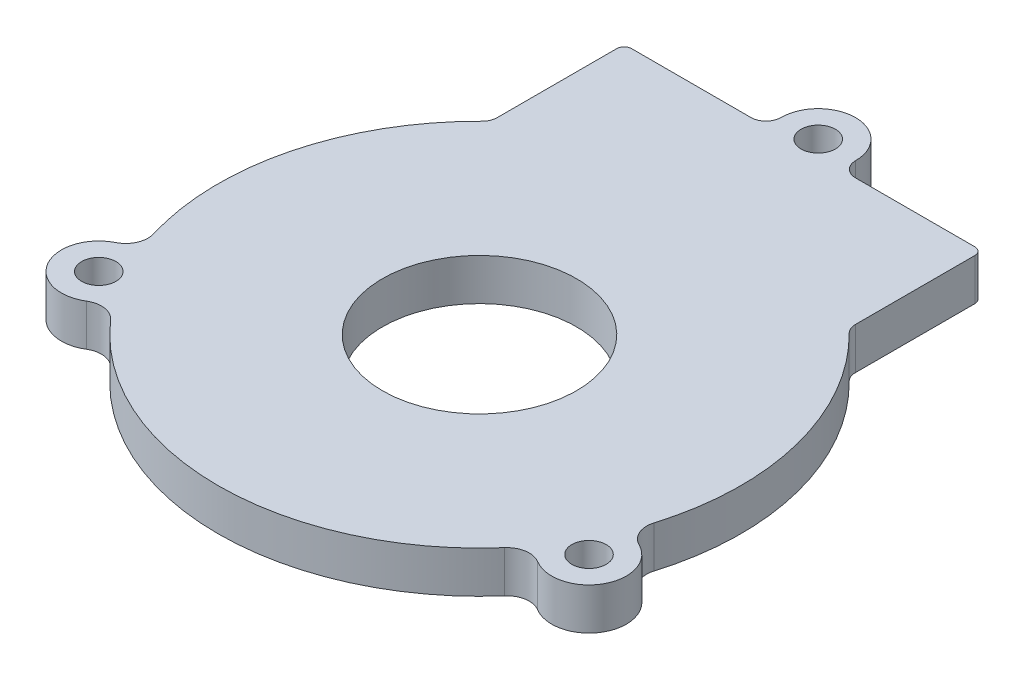
ISO-10303-21;
HEADER;
FILE_DESCRIPTION(('STEP AP214'),'2;1');
FILE_NAME('part.step','',(''),(''),'','','');
FILE_SCHEMA(('AUTOMOTIVE_DESIGN { 1 0 10303 214 1 1 1 1 }'));
ENDSEC;
DATA;
#1=APPLICATION_CONTEXT('core data for automotive mechanical design processes');
#2=APPLICATION_PROTOCOL_DEFINITION('international standard','automotive_design',2000,#1);
#3=PRODUCT_CONTEXT('',#1,'mechanical');
#4=PRODUCT('Part','Part','',(#3));
#5=PRODUCT_RELATED_PRODUCT_CATEGORY('part','',(#4));
#6=PRODUCT_DEFINITION_FORMATION('','',#4);
#7=PRODUCT_DEFINITION_CONTEXT('part definition',#1,'design');
#8=PRODUCT_DEFINITION('design','',#6,#7);
#9=PRODUCT_DEFINITION_SHAPE('','',#8);
#10=(LENGTH_UNIT() NAMED_UNIT(*) SI_UNIT(.MILLI.,.METRE.));
#11=(NAMED_UNIT(*) PLANE_ANGLE_UNIT() SI_UNIT($,.RADIAN.));
#12=(NAMED_UNIT(*) SI_UNIT($,.STERADIAN.) SOLID_ANGLE_UNIT());
#13=UNCERTAINTY_MEASURE_WITH_UNIT(LENGTH_MEASURE(1.E-05),#10,'distance_accuracy_value','');
#14=(GEOMETRIC_REPRESENTATION_CONTEXT(3) GLOBAL_UNCERTAINTY_ASSIGNED_CONTEXT((#13)) GLOBAL_UNIT_ASSIGNED_CONTEXT((#10,
#11,#12)) REPRESENTATION_CONTEXT('',''));
#15=CARTESIAN_POINT('',(0.,0.,0.));
#16=DIRECTION('',(0.,0.,1.));
#17=DIRECTION('',(1.,0.,0.));
#18=AXIS2_PLACEMENT_3D('',#15,#16,#17);
#19=CARTESIAN_POINT('',(32.785,5.588,-68.7014714818341));
#20=DIRECTION('',(0.,-1.,0.));
#21=DIRECTION('',(0.,0.,-1.));
#22=AXIS2_PLACEMENT_3D('',#19,#20,#21);
#23=CYLINDRICAL_SURFACE('',#22,5.);
#24=CARTESIAN_POINT('',(32.785,0.,-68.7014714818341));
#25=DIRECTION('',(0.,1.,0.));
#26=DIRECTION('',(0.,0.,1.));
#27=AXIS2_PLACEMENT_3D('',#24,#25,#26);
#28=CIRCLE('',#27,5.);
#29=CARTESIAN_POINT('',(37.785,0.,-68.7014714818341));
#30=VERTEX_POINT('',#29);
#31=CARTESIAN_POINT('',(27.785,0.,-68.7014714818341));
#32=VERTEX_POINT('',#31);
#33=EDGE_CURVE('E278',#30,#32,#28,.T.);
#34=ORIENTED_EDGE('',*,*,#33,.T.);
#35=DIRECTION('',(0.,-1.,0.));
#36=VECTOR('',#35,1.);
#37=CARTESIAN_POINT('',(27.785,5.588,-68.7014714818341));
#38=LINE('',#37,#36);
#39=CARTESIAN_POINT('',(27.785,5.588,-68.7014714818341));
#40=VERTEX_POINT('',#39);
#41=EDGE_CURVE('E311',#32,#40,#38,.F.);
#42=ORIENTED_EDGE('',*,*,#41,.T.);
#43=CARTESIAN_POINT('',(32.785,5.588,-68.7014714818341));
#44=DIRECTION('',(0.,1.,0.));
#45=DIRECTION('',(0.,0.,1.));
#46=AXIS2_PLACEMENT_3D('',#43,#44,#45);
#47=CIRCLE('',#46,5.);
#48=CARTESIAN_POINT('',(37.785,5.588,-68.7014714818341));
#49=VERTEX_POINT('',#48);
#50=EDGE_CURVE('E380',#49,#40,#47,.T.);
#51=ORIENTED_EDGE('',*,*,#50,.F.);
#52=DIRECTION('',(0.,-1.,0.));
#53=VECTOR('',#52,1.);
#54=CARTESIAN_POINT('',(37.785,5.588,-68.7014714818341));
#55=LINE('',#54,#53);
#56=EDGE_CURVE('E308',#49,#30,#55,.T.);
#57=ORIENTED_EDGE('',*,*,#56,.T.);
#58=EDGE_LOOP('',(#34,#42,#51,#57));
#59=FACE_BOUND('',#58,.T.);
#60=ADVANCED_FACE('F104',(#59),#23,.T.);
#61=CARTESIAN_POINT('',(56.765,5.588,-66.7014714818341));
#62=DIRECTION('',(0.,0.,1.));
#63=DIRECTION('',(1.,0.,0.));
#64=AXIS2_PLACEMENT_3D('',#61,#62,#63);
#65=PLANE('',#64);
#66=DIRECTION('',(-1.,0.,0.));
#67=VECTOR('',#66,1.);
#68=CARTESIAN_POINT('',(56.765,5.588,-66.7014714818341));
#69=LINE('',#68,#67);
#70=CARTESIAN_POINT('',(55.765,5.588,-66.7014714818341));
#71=VERTEX_POINT('',#70);
#72=CARTESIAN_POINT('',(39.785,5.588,-66.7014714818341));
#73=VERTEX_POINT('',#72);
#74=EDGE_CURVE('E363',#71,#73,#69,.T.);
#75=ORIENTED_EDGE('',*,*,#74,.F.);
#76=DIRECTION('',(0.,-1.,0.));
#77=VECTOR('',#76,1.);
#78=CARTESIAN_POINT('',(55.765,0.,-66.7014714818341));
#79=LINE('',#78,#77);
#80=CARTESIAN_POINT('',(55.765,0.,-66.7014714818341));
#81=VERTEX_POINT('',#80);
#82=EDGE_CURVE('E112',#71,#81,#79,.T.);
#83=ORIENTED_EDGE('',*,*,#82,.T.);
#84=DIRECTION('',(-1.,0.,0.));
#85=VECTOR('',#84,1.);
#86=CARTESIAN_POINT('',(56.765,0.,-66.7014714818341));
#87=LINE('',#86,#85);
#88=CARTESIAN_POINT('',(39.785,0.,-66.7014714818341));
#89=VERTEX_POINT('',#88);
#90=EDGE_CURVE('E362',#81,#89,#87,.T.);
#91=ORIENTED_EDGE('',*,*,#90,.T.);
#92=DIRECTION('',(0.,1.,0.));
#93=VECTOR('',#92,1.);
#94=CARTESIAN_POINT('',(39.785,5.588,-66.7014714818341));
#95=LINE('',#94,#93);
#96=EDGE_CURVE('E316',#89,#73,#95,.T.);
#97=ORIENTED_EDGE('',*,*,#96,.T.);
#98=EDGE_LOOP('',(#75,#83,#91,#97));
#99=FACE_BOUND('',#98,.T.);
#100=ADVANCED_FACE('F361',(#99),#65,.F.);
#101=CARTESIAN_POINT('',(65.600049900922,5.588,-5.20147148183409));
#102=DIRECTION('',(0.,-1.,0.));
#103=DIRECTION('',(0.,0.,-1.));
#104=AXIS2_PLACEMENT_3D('',#101,#102,#103);
#105=CYLINDRICAL_SURFACE('',#104,2.29999999999999);
#106=CARTESIAN_POINT('',(65.600049900922,5.588,-5.20147148183409));
#107=DIRECTION('',(0.,1.,0.));
#108=DIRECTION('',(0.,0.,1.));
#109=AXIS2_PLACEMENT_3D('',#106,#107,#108);
#110=CIRCLE('',#109,2.29999999999999);
#111=CARTESIAN_POINT('',(65.600049900922,5.588,-2.9014714818341));
#112=VERTEX_POINT('',#111);
#113=EDGE_CURVE('E404',#112,#112,#110,.T.);
#114=ORIENTED_EDGE('',*,*,#113,.T.);
#115=EDGE_LOOP('',(#114));
#116=FACE_BOUND('',#115,.T.);
#117=CARTESIAN_POINT('',(65.600049900922,0.,-5.20147148183409));
#118=DIRECTION('',(0.,1.,0.));
#119=DIRECTION('',(0.,0.,1.));
#120=AXIS2_PLACEMENT_3D('',#117,#118,#119);
#121=CIRCLE('',#120,2.29999999999999);
#122=CARTESIAN_POINT('',(65.600049900922,0.,-2.9014714818341));
#123=VERTEX_POINT('',#122);
#124=EDGE_CURVE('E408',#123,#123,#121,.T.);
#125=ORIENTED_EDGE('',*,*,#124,.F.);
#126=EDGE_LOOP('',(#125));
#127=FACE_BOUND('',#126,.T.);
#128=ADVANCED_FACE('F489',(#116,#127),#105,.F.);
#129=CARTESIAN_POINT('',(25.785,0.,-66.7014714818341));
#130=VERTEX_POINT('',#129);
#131=CARTESIAN_POINT('',(9.80499999999999,0.,-66.7014714818341));
#132=VERTEX_POINT('',#131);
#133=EDGE_CURVE('E372',#130,#132,#87,.T.);
#134=ORIENTED_EDGE('',*,*,#133,.T.);
#135=DIRECTION('',(0.,-1.,0.));
#136=VECTOR('',#135,1.);
#137=CARTESIAN_POINT('',(9.80499999999999,5.588,-66.7014714818341));
#138=LINE('',#137,#136);
#139=CARTESIAN_POINT('',(9.80499999999999,5.588,-66.7014714818341));
#140=VERTEX_POINT('',#139);
#141=EDGE_CURVE('E353',#132,#140,#138,.F.);
#142=ORIENTED_EDGE('',*,*,#141,.T.);
#143=CARTESIAN_POINT('',(25.785,5.588,-66.7014714818341));
#144=VERTEX_POINT('',#143);
#145=EDGE_CURVE('E426',#144,#140,#69,.T.);
#146=ORIENTED_EDGE('',*,*,#145,.F.);
#147=DIRECTION('',(0.,1.,0.));
#148=VECTOR('',#147,1.);
#149=CARTESIAN_POINT('',(25.785,0.,-66.7014714818341));
#150=LINE('',#149,#148);
#151=EDGE_CURVE('E314',#144,#130,#150,.F.);
#152=ORIENTED_EDGE('',*,*,#151,.T.);
#153=EDGE_LOOP('',(#134,#142,#146,#152));
#154=FACE_BOUND('',#153,.T.);
#155=ADVANCED_FACE('F491',(#154),#65,.F.);
#156=CARTESIAN_POINT('',(56.765,5.588,-66.7014714818341));
#157=DIRECTION('',(1.,0.,0.));
#158=DIRECTION('',(0.,0.,-1.));
#159=AXIS2_PLACEMENT_3D('',#156,#157,#158);
#160=PLANE('',#159);
#161=DIRECTION('',(0.,0.,1.));
#162=VECTOR('',#161,1.);
#163=CARTESIAN_POINT('',(56.765,0.,-66.7014714818341));
#164=LINE('',#163,#162);
#165=CARTESIAN_POINT('',(56.765,0.,-65.7014714818341));
#166=VERTEX_POINT('',#165);
#167=CARTESIAN_POINT('',(56.765,0.,-49.6961028134736));
#168=VERTEX_POINT('',#167);
#169=EDGE_CURVE('E382',#166,#168,#164,.T.);
#170=ORIENTED_EDGE('',*,*,#169,.F.);
#171=DIRECTION('',(0.,-1.,0.));
#172=VECTOR('',#171,1.);
#173=CARTESIAN_POINT('',(56.765,5.588,-65.7014714818341));
#174=LINE('',#173,#172);
#175=CARTESIAN_POINT('',(56.765,5.588,-65.7014714818341));
#176=VERTEX_POINT('',#175);
#177=EDGE_CURVE('E12',#166,#176,#174,.F.);
#178=ORIENTED_EDGE('',*,*,#177,.T.);
#179=DIRECTION('',(0.,0.,1.));
#180=VECTOR('',#179,1.);
#181=CARTESIAN_POINT('',(56.765,5.588,-66.7014714818341));
#182=LINE('',#181,#180);
#183=CARTESIAN_POINT('',(56.765,5.588,-49.6961028134736));
#184=VERTEX_POINT('',#183);
#185=EDGE_CURVE('E371',#176,#184,#182,.T.);
#186=ORIENTED_EDGE('',*,*,#185,.T.);
#187=DIRECTION('',(0.,-1.,0.));
#188=VECTOR('',#187,1.);
#189=CARTESIAN_POINT('',(56.765,5.588,-49.6961028134736));
#190=LINE('',#189,#188);
#191=EDGE_CURVE('E329',#184,#168,#190,.T.);
#192=ORIENTED_EDGE('',*,*,#191,.T.);
#193=EDGE_LOOP('',(#170,#178,#186,#192));
#194=FACE_BOUND('',#193,.T.);
#195=ADVANCED_FACE('F494',(#194),#160,.T.);
#196=CARTESIAN_POINT('',(65.600049900922,5.588,-5.20147148183409));
#197=DIRECTION('',(0.,-1.,0.));
#198=DIRECTION('',(0.,0.,-1.));
#199=AXIS2_PLACEMENT_3D('',#196,#197,#198);
#200=CYLINDRICAL_SURFACE('',#199,5.);
#201=CARTESIAN_POINT('',(65.600049900922,0.,-5.20147148183409));
#202=DIRECTION('',(0.,1.,0.));
#203=DIRECTION('',(0.,0.,1.));
#204=AXIS2_PLACEMENT_3D('',#201,#202,#203);
#205=CIRCLE('',#204,5.);
#206=CARTESIAN_POINT('',(62.9909459014365,0.,-0.936195837767345));
#207=VERTEX_POINT('',#206);
#208=CARTESIAN_POINT('',(67.8263116515634,0.,-9.67849712590082));
#209=VERTEX_POINT('',#208);
#210=EDGE_CURVE('E407',#207,#209,#205,.T.);
#211=ORIENTED_EDGE('',*,*,#210,.T.);
#212=DIRECTION('',(0.,-1.,0.));
#213=VECTOR('',#212,1.);
#214=CARTESIAN_POINT('',(67.8263116515634,5.588,-9.67849712590082));
#215=LINE('',#214,#213);
#216=CARTESIAN_POINT('',(67.8263116515634,5.588,-9.67849712590082));
#217=VERTEX_POINT('',#216);
#218=EDGE_CURVE('E272',#209,#217,#215,.F.);
#219=ORIENTED_EDGE('',*,*,#218,.T.);
#220=CARTESIAN_POINT('',(65.600049900922,5.588,-5.20147148183409));
#221=DIRECTION('',(0.,1.,0.));
#222=DIRECTION('',(0.,0.,1.));
#223=AXIS2_PLACEMENT_3D('',#220,#221,#222);
#224=CIRCLE('',#223,5.);
#225=CARTESIAN_POINT('',(62.9909459014365,5.588,-0.936195837767345));
#226=VERTEX_POINT('',#225);
#227=EDGE_CURVE('E248',#226,#217,#224,.T.);
#228=ORIENTED_EDGE('',*,*,#227,.F.);
#229=DIRECTION('',(0.,-1.,0.));
#230=VECTOR('',#229,1.);
#231=CARTESIAN_POINT('',(62.9909459014365,5.588,-0.936195837767345));
#232=LINE('',#231,#230);
#233=EDGE_CURVE('E269',#226,#207,#232,.T.);
#234=ORIENTED_EDGE('',*,*,#233,.T.);
#235=EDGE_LOOP('',(#211,#219,#228,#234));
#236=FACE_BOUND('',#235,.T.);
#237=ADVANCED_FACE('F474',(#236),#200,.T.);
#238=CARTESIAN_POINT('',(8.80499999999999,5.588,-66.7014714818341));
#239=DIRECTION('',(1.,0.,0.));
#240=DIRECTION('',(0.,0.,-1.));
#241=AXIS2_PLACEMENT_3D('',#238,#239,#240);
#242=PLANE('',#241);
#243=DIRECTION('',(0.,0.,1.));
#244=VECTOR('',#243,1.);
#245=CARTESIAN_POINT('',(8.80499999999999,5.588,-66.7014714818341));
#246=LINE('',#245,#244);
#247=CARTESIAN_POINT('',(8.80499999999999,5.588,-65.7014714818341));
#248=VERTEX_POINT('',#247);
#249=CARTESIAN_POINT('',(8.80499999999999,5.588,-49.6961028134736));
#250=VERTEX_POINT('',#249);
#251=EDGE_CURVE('E374',#248,#250,#246,.T.);
#252=ORIENTED_EDGE('',*,*,#251,.F.);
#253=DIRECTION('',(0.,-1.,0.));
#254=VECTOR('',#253,1.);
#255=CARTESIAN_POINT('',(8.80499999999999,5.588,-65.7014714818341));
#256=LINE('',#255,#254);
#257=CARTESIAN_POINT('',(8.80499999999999,0.,-65.7014714818341));
#258=VERTEX_POINT('',#257);
#259=EDGE_CURVE('E346',#248,#258,#256,.T.);
#260=ORIENTED_EDGE('',*,*,#259,.T.);
#261=DIRECTION('',(0.,0.,1.));
#262=VECTOR('',#261,1.);
#263=CARTESIAN_POINT('',(8.80499999999999,0.,-66.7014714818341));
#264=LINE('',#263,#262);
#265=CARTESIAN_POINT('',(8.80499999999999,0.,-49.6961028134736));
#266=VERTEX_POINT('',#265);
#267=EDGE_CURVE('E377',#258,#266,#264,.T.);
#268=ORIENTED_EDGE('',*,*,#267,.T.);
#269=DIRECTION('',(0.,1.,0.));
#270=VECTOR('',#269,1.);
#271=CARTESIAN_POINT('',(8.80499999999999,5.588,-49.6961028134736));
#272=LINE('',#271,#270);
#273=EDGE_CURVE('E332',#266,#250,#272,.T.);
#274=ORIENTED_EDGE('',*,*,#273,.T.);
#275=EDGE_LOOP('',(#252,#260,#268,#274));
#276=FACE_BOUND('',#275,.T.);
#277=ADVANCED_FACE('F437',(#276),#242,.F.);
#278=CARTESIAN_POINT('',(32.785,5.588,-23.3514714818341));
#279=DIRECTION('',(0.,-1.,0.));
#280=DIRECTION('',(0.,0.,-1.));
#281=AXIS2_PLACEMENT_3D('',#278,#279,#280);
#282=CYLINDRICAL_SURFACE('',#281,13.);
#283=CARTESIAN_POINT('',(32.785,5.588,-23.3514714818341));
#284=DIRECTION('',(0.,1.,0.));
#285=DIRECTION('',(0.,0.,1.));
#286=AXIS2_PLACEMENT_3D('',#283,#284,#285);
#287=CIRCLE('',#286,13.);
#288=CARTESIAN_POINT('',(32.785,5.588,-10.3514714818341));
#289=VERTEX_POINT('',#288);
#290=EDGE_CURVE('E414',#289,#289,#287,.T.);
#291=ORIENTED_EDGE('',*,*,#290,.T.);
#292=EDGE_LOOP('',(#291));
#293=FACE_BOUND('',#292,.T.);
#294=CARTESIAN_POINT('',(32.785,0.,-23.3514714818341));
#295=DIRECTION('',(0.,1.,0.));
#296=DIRECTION('',(0.,0.,1.));
#297=AXIS2_PLACEMENT_3D('',#294,#295,#296);
#298=CIRCLE('',#297,13.);
#299=CARTESIAN_POINT('',(32.785,0.,-10.3514714818341));
#300=VERTEX_POINT('',#299);
#301=EDGE_CURVE('E418',#300,#300,#298,.T.);
#302=ORIENTED_EDGE('',*,*,#301,.F.);
#303=EDGE_LOOP('',(#302));
#304=FACE_BOUND('',#303,.T.);
#305=ADVANCED_FACE('F560',(#293,#304),#282,.F.);
#306=CARTESIAN_POINT('',(32.785,5.588,-23.3514714818341));
#307=DIRECTION('',(0.,-1.,0.));
#308=DIRECTION('',(0.,0.,-1.));
#309=AXIS2_PLACEMENT_3D('',#306,#307,#308);
#310=CYLINDRICAL_SURFACE('',#309,35.);
#311=CARTESIAN_POINT('',(32.785,5.588,-23.3514714818341));
#312=DIRECTION('',(0.,1.,0.));
#313=DIRECTION('',(0.,0.,1.));
#314=AXIS2_PLACEMENT_3D('',#311,#312,#313);
#315=CIRCLE('',#314,35.);
#316=CARTESIAN_POINT('',(8.20932432432432,5.588,-48.272068687439));
#317=VERTEX_POINT('',#316);
#318=CARTESIAN_POINT('',(-0.720194857057592,5.588,-13.2320882204588));
#319=VERTEX_POINT('',#318);
#320=EDGE_CURVE('E267',#317,#319,#315,.T.);
#321=ORIENTED_EDGE('',*,*,#320,.F.);
#322=DIRECTION('',(0.,-1.,0.));
#323=VECTOR('',#322,1.);
#324=CARTESIAN_POINT('',(8.20932432432431,5.588,-48.272068687439));
#325=LINE('',#324,#323);
#326=CARTESIAN_POINT('',(8.20932432432432,0.,-48.272068687439));
#327=VERTEX_POINT('',#326);
#328=EDGE_CURVE('E335',#317,#327,#325,.T.);
#329=ORIENTED_EDGE('',*,*,#328,.T.);
#330=CARTESIAN_POINT('',(32.785,0.,-23.3514714818341));
#331=DIRECTION('',(0.,1.,0.));
#332=DIRECTION('',(0.,0.,1.));
#333=AXIS2_PLACEMENT_3D('',#330,#331,#332);
#334=CIRCLE('',#333,35.);
#335=CARTESIAN_POINT('',(-0.720194857057592,0.,-13.2320882204588));
#336=VERTEX_POINT('',#335);
#337=EDGE_CURVE('E265',#327,#336,#334,.T.);
#338=ORIENTED_EDGE('',*,*,#337,.T.);
#339=DIRECTION('',(0.,-1.,0.));
#340=VECTOR('',#339,1.);
#341=CARTESIAN_POINT('',(-0.720194857057592,5.588,-13.2320882204588));
#342=LINE('',#341,#340);
#343=EDGE_CURVE('E288',#336,#319,#342,.F.);
#344=ORIENTED_EDGE('',*,*,#343,.T.);
#345=EDGE_LOOP('',(#321,#329,#338,#344));
#346=FACE_BOUND('',#345,.T.);
#347=ADVANCED_FACE('F449',(#346),#310,.T.);
#348=CARTESIAN_POINT('',(66.2901948570576,0.,-13.2320882204588));
#349=VERTEX_POINT('',#348);
#350=CARTESIAN_POINT('',(57.3606756756757,0.,-48.272068687439));
#351=VERTEX_POINT('',#350);
#352=EDGE_CURVE('E417',#349,#351,#334,.T.);
#353=ORIENTED_EDGE('',*,*,#352,.T.);
#354=DIRECTION('',(0.,-1.,0.));
#355=VECTOR('',#354,1.);
#356=CARTESIAN_POINT('',(57.3606756756757,5.588,-48.272068687439));
#357=LINE('',#356,#355);
#358=CARTESIAN_POINT('',(57.3606756756757,5.588,-48.272068687439));
#359=VERTEX_POINT('',#358);
#360=EDGE_CURVE('E263',#351,#359,#357,.F.);
#361=ORIENTED_EDGE('',*,*,#360,.T.);
#362=CARTESIAN_POINT('',(66.2901948570576,5.588,-13.2320882204588));
#363=VERTEX_POINT('',#362);
#364=EDGE_CURVE('E246',#363,#359,#315,.T.);
#365=ORIENTED_EDGE('',*,*,#364,.F.);
#366=DIRECTION('',(0.,-1.,0.));
#367=VECTOR('',#366,1.);
#368=CARTESIAN_POINT('',(66.2901948570576,5.588,-13.2320882204588));
#369=LINE('',#368,#367);
#370=EDGE_CURVE('E260',#363,#349,#369,.T.);
#371=ORIENTED_EDGE('',*,*,#370,.T.);
#372=EDGE_LOOP('',(#353,#361,#365,#371));
#373=FACE_BOUND('',#372,.T.);
#374=ADVANCED_FACE('F259',(#373),#310,.T.);
#375=CARTESIAN_POINT('',(6.40560730102413,0.,-0.348696848472562));
#376=VERTEX_POINT('',#375);
#377=CARTESIAN_POINT('',(59.1643926989759,0.,-0.348696848472559));
#378=VERTEX_POINT('',#377);
#379=EDGE_CURVE('E422',#376,#378,#334,.T.);
#380=ORIENTED_EDGE('',*,*,#379,.T.);
#381=DIRECTION('',(0.,-1.,0.));
#382=VECTOR('',#381,1.);
#383=CARTESIAN_POINT('',(59.1643926989759,5.588,-0.348696848472559));
#384=LINE('',#383,#382);
#385=CARTESIAN_POINT('',(59.1643926989759,5.588,-0.348696848472559));
#386=VERTEX_POINT('',#385);
#387=EDGE_CURVE('E285',#378,#386,#384,.F.);
#388=ORIENTED_EDGE('',*,*,#387,.T.);
#389=CARTESIAN_POINT('',(6.40560730102413,5.588,-0.348696848472562));
#390=VERTEX_POINT('',#389);
#391=EDGE_CURVE('E264',#390,#386,#315,.T.);
#392=ORIENTED_EDGE('',*,*,#391,.F.);
#393=DIRECTION('',(0.,-1.,0.));
#394=VECTOR('',#393,1.);
#395=CARTESIAN_POINT('',(6.40560730102413,5.588,-0.348696848472562));
#396=LINE('',#395,#394);
#397=EDGE_CURVE('E282',#390,#376,#396,.T.);
#398=ORIENTED_EDGE('',*,*,#397,.T.);
#399=EDGE_LOOP('',(#380,#388,#392,#398));
#400=FACE_BOUND('',#399,.T.);
#401=ADVANCED_FACE('F466',(#400),#310,.T.);
#402=CARTESIAN_POINT('',(-0.0300499009219918,5.588,-5.20147148183409));
#403=DIRECTION('',(0.,-1.,0.));
#404=DIRECTION('',(0.,0.,-1.));
#405=AXIS2_PLACEMENT_3D('',#402,#403,#404);
#406=CYLINDRICAL_SURFACE('',#405,2.3);
#407=CARTESIAN_POINT('',(-0.0300499009219918,5.588,-5.20147148183409));
#408=DIRECTION('',(0.,1.,0.));
#409=DIRECTION('',(0.,0.,1.));
#410=AXIS2_PLACEMENT_3D('',#407,#408,#409);
#411=CIRCLE('',#410,2.3);
#412=CARTESIAN_POINT('',(-0.0300499009219918,5.588,-2.90147148183409));
#413=VERTEX_POINT('',#412);
#414=EDGE_CURVE('E396',#413,#413,#411,.T.);
#415=ORIENTED_EDGE('',*,*,#414,.T.);
#416=EDGE_LOOP('',(#415));
#417=FACE_BOUND('',#416,.T.);
#418=CARTESIAN_POINT('',(-0.0300499009219918,0.,-5.20147148183409));
#419=DIRECTION('',(0.,1.,0.));
#420=DIRECTION('',(0.,0.,1.));
#421=AXIS2_PLACEMENT_3D('',#418,#419,#420);
#422=CIRCLE('',#421,2.3);
#423=CARTESIAN_POINT('',(-0.0300499009219918,0.,-2.90147148183409));
#424=VERTEX_POINT('',#423);
#425=EDGE_CURVE('E399',#424,#424,#422,.T.);
#426=ORIENTED_EDGE('',*,*,#425,.F.);
#427=EDGE_LOOP('',(#426));
#428=FACE_BOUND('',#427,.T.);
#429=ADVANCED_FACE('F549',(#417,#428),#406,.F.);
#430=CARTESIAN_POINT('',(-0.0300499009219918,0.,-5.20147148183409));
#431=DIRECTION('',(0.,1.,0.));
#432=DIRECTION('',(0.,0.,1.));
#433=AXIS2_PLACEMENT_3D('',#430,#431,#432);
#434=PLANE('',#433);
#435=CARTESIAN_POINT('',(32.785,0.,-68.7014714818341));
#436=DIRECTION('',(0.,1.,0.));
#437=DIRECTION('',(0.,0.,1.));
#438=AXIS2_PLACEMENT_3D('',#435,#436,#437);
#439=CIRCLE('',#438,2.3);
#440=CARTESIAN_POINT('',(32.785,0.,-66.4014714818341));
#441=VERTEX_POINT('',#440);
#442=EDGE_CURVE('E385',#441,#441,#439,.T.);
#443=ORIENTED_EDGE('',*,*,#442,.T.);
#444=EDGE_LOOP('',(#443));
#445=FACE_BOUND('',#444,.T.);
#446=ORIENTED_EDGE('',*,*,#267,.F.);
#447=CARTESIAN_POINT('',(9.80499999999999,0.,-65.7014714818341));
#448=DIRECTION('',(0.,1.,0.));
#449=DIRECTION('',(0.,0.,1.));
#450=AXIS2_PLACEMENT_3D('',#447,#448,#449);
#451=CIRCLE('',#450,1.);
#452=EDGE_CURVE('E351',#258,#132,#451,.F.);
#453=ORIENTED_EDGE('',*,*,#452,.T.);
#454=ORIENTED_EDGE('',*,*,#133,.F.);
#455=CARTESIAN_POINT('',(25.785,0.,-68.7014714818341));
#456=DIRECTION('',(0.,1.,0.));
#457=DIRECTION('',(0.,0.,1.));
#458=AXIS2_PLACEMENT_3D('',#455,#456,#457);
#459=CIRCLE('',#458,2.);
#460=EDGE_CURVE('E321',#130,#32,#459,.T.);
#461=ORIENTED_EDGE('',*,*,#460,.T.);
#462=ORIENTED_EDGE('',*,*,#33,.F.);
#463=CARTESIAN_POINT('',(39.785,0.,-68.7014714818341));
#464=DIRECTION('',(0.,1.,0.));
#465=DIRECTION('',(0.,0.,1.));
#466=AXIS2_PLACEMENT_3D('',#463,#464,#465);
#467=CIRCLE('',#466,2.);
#468=EDGE_CURVE('E323',#30,#89,#467,.T.);
#469=ORIENTED_EDGE('',*,*,#468,.T.);
#470=ORIENTED_EDGE('',*,*,#90,.F.);
#471=CARTESIAN_POINT('',(55.765,0.,-65.7014714818341));
#472=DIRECTION('',(0.,1.,0.));
#473=DIRECTION('',(0.,0.,1.));
#474=AXIS2_PLACEMENT_3D('',#471,#472,#473);
#475=CIRCLE('',#474,1.);
#476=EDGE_CURVE('E349',#81,#166,#475,.F.);
#477=ORIENTED_EDGE('',*,*,#476,.T.);
#478=ORIENTED_EDGE('',*,*,#169,.T.);
#479=CARTESIAN_POINT('',(58.765,0.,-49.6961028134736));
#480=DIRECTION('',(0.,1.,0.));
#481=DIRECTION('',(0.,0.,1.));
#482=AXIS2_PLACEMENT_3D('',#479,#480,#481);
#483=CIRCLE('',#482,2.);
#484=EDGE_CURVE('E339',#168,#351,#483,.T.);
#485=ORIENTED_EDGE('',*,*,#484,.T.);
#486=ORIENTED_EDGE('',*,*,#352,.F.);
#487=CARTESIAN_POINT('',(69.1620687019482,0.,-12.3647125123409));
#488=DIRECTION('',(0.,1.,0.));
#489=DIRECTION('',(0.,0.,1.));
#490=AXIS2_PLACEMENT_3D('',#487,#488,#489);
#491=CIRCLE('',#490,3.);
#492=EDGE_CURVE('E253',#349,#209,#491,.T.);
#493=ORIENTED_EDGE('',*,*,#492,.T.);
#494=ORIENTED_EDGE('',*,*,#210,.F.);
#495=CARTESIAN_POINT('',(61.4254835017452,0.,1.62296954867271));
#496=DIRECTION('',(0.,1.,0.));
#497=DIRECTION('',(0.,0.,1.));
#498=AXIS2_PLACEMENT_3D('',#495,#496,#497);
#499=CIRCLE('',#498,3.);
#500=EDGE_CURVE('E297',#207,#378,#499,.T.);
#501=ORIENTED_EDGE('',*,*,#500,.T.);
#502=ORIENTED_EDGE('',*,*,#379,.F.);
#503=CARTESIAN_POINT('',(4.14451649825476,0.,1.62296954867271));
#504=DIRECTION('',(0.,1.,0.));
#505=DIRECTION('',(0.,0.,1.));
#506=AXIS2_PLACEMENT_3D('',#503,#504,#505);
#507=CIRCLE('',#506,3.);
#508=CARTESIAN_POINT('',(2.57905409856348,0.,-0.936195837767343));
#509=VERTEX_POINT('',#508);
#510=EDGE_CURVE('E304',#376,#509,#507,.T.);
#511=ORIENTED_EDGE('',*,*,#510,.T.);
#512=CARTESIAN_POINT('',(-0.0300499009219918,0.,-5.20147148183409));
#513=DIRECTION('',(0.,1.,0.));
#514=DIRECTION('',(0.,0.,1.));
#515=AXIS2_PLACEMENT_3D('',#512,#513,#514);
#516=CIRCLE('',#515,5.);
#517=CARTESIAN_POINT('',(-2.2563116515634,0.,-9.67849712590082));
#518=VERTEX_POINT('',#517);
#519=EDGE_CURVE('E275',#518,#509,#516,.T.);
#520=ORIENTED_EDGE('',*,*,#519,.F.);
#521=CARTESIAN_POINT('',(-3.59206870194825,0.,-12.3647125123409));
#522=DIRECTION('',(0.,1.,0.));
#523=DIRECTION('',(0.,0.,1.));
#524=AXIS2_PLACEMENT_3D('',#521,#522,#523);
#525=CIRCLE('',#524,3.);
#526=EDGE_CURVE('E301',#518,#336,#525,.T.);
#527=ORIENTED_EDGE('',*,*,#526,.T.);
#528=ORIENTED_EDGE('',*,*,#337,.F.);
#529=CARTESIAN_POINT('',(6.80499999999999,0.,-49.6961028134736));
#530=DIRECTION('',(0.,1.,0.));
#531=DIRECTION('',(0.,0.,1.));
#532=AXIS2_PLACEMENT_3D('',#529,#530,#531);
#533=CIRCLE('',#532,2.);
#534=EDGE_CURVE('E343',#327,#266,#533,.T.);
#535=ORIENTED_EDGE('',*,*,#534,.T.);
#536=EDGE_LOOP('',(#446,#453,#454,#461,#462,#469,#470,#477,#478,#485,#486,#493,#494,#501,#502,
#511,#520,#527,#528,#535));
#537=FACE_BOUND('',#536,.T.);
#538=ORIENTED_EDGE('',*,*,#425,.T.);
#539=EDGE_LOOP('',(#538));
#540=FACE_BOUND('',#539,.T.);
#541=ORIENTED_EDGE('',*,*,#301,.T.);
#542=EDGE_LOOP('',(#541));
#543=FACE_BOUND('',#542,.T.);
#544=ORIENTED_EDGE('',*,*,#124,.T.);
#545=EDGE_LOOP('',(#544));
#546=FACE_BOUND('',#545,.T.);
#547=ADVANCED_FACE('F367',(#445,#537,#540,#543,#546),#434,.F.);
#548=CARTESIAN_POINT('',(-0.0300499009219918,5.588,-5.20147148183409));
#549=DIRECTION('',(0.,1.,0.));
#550=DIRECTION('',(0.,0.,1.));
#551=AXIS2_PLACEMENT_3D('',#548,#549,#550);
#552=PLANE('',#551);
#553=CARTESIAN_POINT('',(32.785,5.588,-68.7014714818341));
#554=DIRECTION('',(0.,1.,0.));
#555=DIRECTION('',(0.,0.,1.));
#556=AXIS2_PLACEMENT_3D('',#553,#554,#555);
#557=CIRCLE('',#556,2.3);
#558=CARTESIAN_POINT('',(32.785,5.588,-66.4014714818341));
#559=VERTEX_POINT('',#558);
#560=EDGE_CURVE('E389',#559,#559,#557,.T.);
#561=ORIENTED_EDGE('',*,*,#560,.F.);
#562=EDGE_LOOP('',(#561));
#563=FACE_BOUND('',#562,.T.);
#564=ORIENTED_EDGE('',*,*,#145,.T.);
#565=CARTESIAN_POINT('',(9.80499999999999,5.588,-65.7014714818341));
#566=DIRECTION('',(0.,1.,0.));
#567=DIRECTION('',(0.,0.,1.));
#568=AXIS2_PLACEMENT_3D('',#565,#566,#567);
#569=CIRCLE('',#568,1.);
#570=EDGE_CURVE('E356',#140,#248,#569,.T.);
#571=ORIENTED_EDGE('',*,*,#570,.T.);
#572=ORIENTED_EDGE('',*,*,#251,.T.);
#573=CARTESIAN_POINT('',(6.80499999999999,5.588,-49.6961028134736));
#574=DIRECTION('',(0.,1.,0.));
#575=DIRECTION('',(0.,0.,1.));
#576=AXIS2_PLACEMENT_3D('',#573,#574,#575);
#577=CIRCLE('',#576,2.);
#578=EDGE_CURVE('E341',#250,#317,#577,.F.);
#579=ORIENTED_EDGE('',*,*,#578,.T.);
#580=ORIENTED_EDGE('',*,*,#320,.T.);
#581=CARTESIAN_POINT('',(-3.59206870194825,5.588,-12.3647125123409));
#582=DIRECTION('',(0.,1.,0.));
#583=DIRECTION('',(0.,0.,1.));
#584=AXIS2_PLACEMENT_3D('',#581,#582,#583);
#585=CIRCLE('',#584,3.);
#586=CARTESIAN_POINT('',(-2.2563116515634,5.588,-9.67849712590082));
#587=VERTEX_POINT('',#586);
#588=EDGE_CURVE('E299',#319,#587,#585,.F.);
#589=ORIENTED_EDGE('',*,*,#588,.T.);
#590=CARTESIAN_POINT('',(-0.0300499009219918,5.588,-5.20147148183409));
#591=DIRECTION('',(0.,1.,0.));
#592=DIRECTION('',(0.,0.,1.));
#593=AXIS2_PLACEMENT_3D('',#590,#591,#592);
#594=CIRCLE('',#593,5.);
#595=CARTESIAN_POINT('',(2.57905409856348,5.588,-0.936195837767343));
#596=VERTEX_POINT('',#595);
#597=EDGE_CURVE('E270',#587,#596,#594,.T.);
#598=ORIENTED_EDGE('',*,*,#597,.T.);
#599=CARTESIAN_POINT('',(4.14451649825476,5.588,1.62296954867271));
#600=DIRECTION('',(0.,1.,0.));
#601=DIRECTION('',(0.,0.,1.));
#602=AXIS2_PLACEMENT_3D('',#599,#600,#601);
#603=CIRCLE('',#602,3.);
#604=EDGE_CURVE('E306',#596,#390,#603,.F.);
#605=ORIENTED_EDGE('',*,*,#604,.T.);
#606=ORIENTED_EDGE('',*,*,#391,.T.);
#607=CARTESIAN_POINT('',(61.4254835017452,5.588,1.62296954867271));
#608=DIRECTION('',(0.,1.,0.));
#609=DIRECTION('',(0.,0.,1.));
#610=AXIS2_PLACEMENT_3D('',#607,#608,#609);
#611=CIRCLE('',#610,3.);
#612=EDGE_CURVE('E252',#386,#226,#611,.F.);
#613=ORIENTED_EDGE('',*,*,#612,.T.);
#614=ORIENTED_EDGE('',*,*,#227,.T.);
#615=CARTESIAN_POINT('',(69.1620687019482,5.588,-12.3647125123409));
#616=DIRECTION('',(0.,1.,0.));
#617=DIRECTION('',(0.,0.,1.));
#618=AXIS2_PLACEMENT_3D('',#615,#616,#617);
#619=CIRCLE('',#618,3.);
#620=EDGE_CURVE('E240',#217,#363,#619,.F.);
#621=ORIENTED_EDGE('',*,*,#620,.T.);
#622=ORIENTED_EDGE('',*,*,#364,.T.);
#623=CARTESIAN_POINT('',(58.765,5.588,-49.6961028134736));
#624=DIRECTION('',(0.,1.,0.));
#625=DIRECTION('',(0.,0.,1.));
#626=AXIS2_PLACEMENT_3D('',#623,#624,#625);
#627=CIRCLE('',#626,2.);
#628=EDGE_CURVE('E337',#359,#184,#627,.F.);
#629=ORIENTED_EDGE('',*,*,#628,.T.);
#630=ORIENTED_EDGE('',*,*,#185,.F.);
#631=CARTESIAN_POINT('',(55.765,5.588,-65.7014714818341));
#632=DIRECTION('',(0.,1.,0.));
#633=DIRECTION('',(0.,0.,1.));
#634=AXIS2_PLACEMENT_3D('',#631,#632,#633);
#635=CIRCLE('',#634,1.);
#636=EDGE_CURVE('E119',#176,#71,#635,.T.);
#637=ORIENTED_EDGE('',*,*,#636,.T.);
#638=ORIENTED_EDGE('',*,*,#74,.T.);
#639=CARTESIAN_POINT('',(39.785,5.588,-68.7014714818341));
#640=DIRECTION('',(0.,1.,0.));
#641=DIRECTION('',(0.,0.,1.));
#642=AXIS2_PLACEMENT_3D('',#639,#640,#641);
#643=CIRCLE('',#642,2.);
#644=EDGE_CURVE('E326',#73,#49,#643,.F.);
#645=ORIENTED_EDGE('',*,*,#644,.T.);
#646=ORIENTED_EDGE('',*,*,#50,.T.);
#647=CARTESIAN_POINT('',(25.785,5.588,-68.7014714818341));
#648=DIRECTION('',(0.,1.,0.));
#649=DIRECTION('',(0.,0.,1.));
#650=AXIS2_PLACEMENT_3D('',#647,#648,#649);
#651=CIRCLE('',#650,2.);
#652=EDGE_CURVE('E319',#40,#144,#651,.F.);
#653=ORIENTED_EDGE('',*,*,#652,.T.);
#654=EDGE_LOOP('',(#564,#571,#572,#579,#580,#589,#598,#605,#606,#613,#614,#621,#622,#629,#630,
#637,#638,#645,#646,#653));
#655=FACE_BOUND('',#654,.T.);
#656=ORIENTED_EDGE('',*,*,#414,.F.);
#657=EDGE_LOOP('',(#656));
#658=FACE_BOUND('',#657,.T.);
#659=ORIENTED_EDGE('',*,*,#290,.F.);
#660=EDGE_LOOP('',(#659));
#661=FACE_BOUND('',#660,.T.);
#662=ORIENTED_EDGE('',*,*,#113,.F.);
#663=EDGE_LOOP('',(#662));
#664=FACE_BOUND('',#663,.T.);
#665=ADVANCED_FACE('F243',(#563,#655,#658,#661,#664),#552,.T.);
#666=CARTESIAN_POINT('',(-0.0300499009219918,5.588,-5.20147148183409));
#667=DIRECTION('',(0.,-1.,0.));
#668=DIRECTION('',(0.,0.,-1.));
#669=AXIS2_PLACEMENT_3D('',#666,#667,#668);
#670=CYLINDRICAL_SURFACE('',#669,5.);
#671=ORIENTED_EDGE('',*,*,#597,.F.);
#672=DIRECTION('',(0.,-1.,0.));
#673=VECTOR('',#672,1.);
#674=CARTESIAN_POINT('',(-2.2563116515634,5.588,-9.67849712590082));
#675=LINE('',#674,#673);
#676=EDGE_CURVE('E293',#587,#518,#675,.T.);
#677=ORIENTED_EDGE('',*,*,#676,.T.);
#678=ORIENTED_EDGE('',*,*,#519,.T.);
#679=DIRECTION('',(0.,-1.,0.));
#680=VECTOR('',#679,1.);
#681=CARTESIAN_POINT('',(2.57905409856348,5.588,-0.936195837767343));
#682=LINE('',#681,#680);
#683=EDGE_CURVE('E291',#509,#596,#682,.F.);
#684=ORIENTED_EDGE('',*,*,#683,.T.);
#685=EDGE_LOOP('',(#671,#677,#678,#684));
#686=FACE_BOUND('',#685,.T.);
#687=ADVANCED_FACE('F458',(#686),#670,.T.);
#688=CARTESIAN_POINT('',(32.785,5.588,-68.7014714818341));
#689=DIRECTION('',(0.,1.,0.));
#690=DIRECTION('',(0.,0.,1.));
#691=AXIS2_PLACEMENT_3D('',#688,#689,#690);
#692=CYLINDRICAL_SURFACE('',#691,2.3);
#693=ORIENTED_EDGE('',*,*,#442,.F.);
#694=EDGE_LOOP('',(#693));
#695=FACE_BOUND('',#694,.T.);
#696=ORIENTED_EDGE('',*,*,#560,.T.);
#697=EDGE_LOOP('',(#696));
#698=FACE_BOUND('',#697,.T.);
#699=ADVANCED_FACE('F498',(#695,#698),#692,.F.);
#700=CARTESIAN_POINT('',(69.1620687019482,5.588,-12.3647125123409));
#701=DIRECTION('',(0.,1.,0.));
#702=DIRECTION('',(0.,0.,1.));
#703=AXIS2_PLACEMENT_3D('',#700,#701,#702);
#704=CYLINDRICAL_SURFACE('',#703,3.);
#705=ORIENTED_EDGE('',*,*,#620,.F.);
#706=ORIENTED_EDGE('',*,*,#218,.F.);
#707=ORIENTED_EDGE('',*,*,#492,.F.);
#708=ORIENTED_EDGE('',*,*,#370,.F.);
#709=EDGE_LOOP('',(#705,#706,#707,#708));
#710=FACE_BOUND('',#709,.T.);
#711=ADVANCED_FACE('F268',(#710),#704,.F.);
#712=CARTESIAN_POINT('',(61.4254835017452,5.588,1.62296954867271));
#713=DIRECTION('',(0.,-1.,0.));
#714=DIRECTION('',(0.,0.,-1.));
#715=AXIS2_PLACEMENT_3D('',#712,#713,#714);
#716=CYLINDRICAL_SURFACE('',#715,3.);
#717=ORIENTED_EDGE('',*,*,#500,.F.);
#718=ORIENTED_EDGE('',*,*,#233,.F.);
#719=ORIENTED_EDGE('',*,*,#612,.F.);
#720=ORIENTED_EDGE('',*,*,#387,.F.);
#721=EDGE_LOOP('',(#717,#718,#719,#720));
#722=FACE_BOUND('',#721,.T.);
#723=ADVANCED_FACE('F471',(#722),#716,.F.);
#724=CARTESIAN_POINT('',(-3.59206870194825,5.588,-12.3647125123409));
#725=DIRECTION('',(0.,-1.,0.));
#726=DIRECTION('',(0.,0.,-1.));
#727=AXIS2_PLACEMENT_3D('',#724,#725,#726);
#728=CYLINDRICAL_SURFACE('',#727,3.);
#729=ORIENTED_EDGE('',*,*,#526,.F.);
#730=ORIENTED_EDGE('',*,*,#676,.F.);
#731=ORIENTED_EDGE('',*,*,#588,.F.);
#732=ORIENTED_EDGE('',*,*,#343,.F.);
#733=EDGE_LOOP('',(#729,#730,#731,#732));
#734=FACE_BOUND('',#733,.T.);
#735=ADVANCED_FACE('F453',(#734),#728,.F.);
#736=CARTESIAN_POINT('',(4.14451649825476,5.588,1.62296954867271));
#737=DIRECTION('',(0.,1.,0.));
#738=DIRECTION('',(0.,0.,1.));
#739=AXIS2_PLACEMENT_3D('',#736,#737,#738);
#740=CYLINDRICAL_SURFACE('',#739,3.);
#741=ORIENTED_EDGE('',*,*,#604,.F.);
#742=ORIENTED_EDGE('',*,*,#683,.F.);
#743=ORIENTED_EDGE('',*,*,#510,.F.);
#744=ORIENTED_EDGE('',*,*,#397,.F.);
#745=EDGE_LOOP('',(#741,#742,#743,#744));
#746=FACE_BOUND('',#745,.T.);
#747=ADVANCED_FACE('F462',(#746),#740,.F.);
#748=CARTESIAN_POINT('',(25.785,5.588,-68.7014714818341));
#749=DIRECTION('',(0.,-1.,0.));
#750=DIRECTION('',(0.,0.,-1.));
#751=AXIS2_PLACEMENT_3D('',#748,#749,#750);
#752=CYLINDRICAL_SURFACE('',#751,2.);
#753=ORIENTED_EDGE('',*,*,#460,.F.);
#754=ORIENTED_EDGE('',*,*,#151,.F.);
#755=ORIENTED_EDGE('',*,*,#652,.F.);
#756=ORIENTED_EDGE('',*,*,#41,.F.);
#757=EDGE_LOOP('',(#753,#754,#755,#756));
#758=FACE_BOUND('',#757,.T.);
#759=ADVANCED_FACE('F505',(#758),#752,.F.);
#760=CARTESIAN_POINT('',(39.785,5.588,-68.7014714818341));
#761=DIRECTION('',(0.,-1.,0.));
#762=DIRECTION('',(0.,0.,-1.));
#763=AXIS2_PLACEMENT_3D('',#760,#761,#762);
#764=CYLINDRICAL_SURFACE('',#763,2.);
#765=ORIENTED_EDGE('',*,*,#644,.F.);
#766=ORIENTED_EDGE('',*,*,#96,.F.);
#767=ORIENTED_EDGE('',*,*,#468,.F.);
#768=ORIENTED_EDGE('',*,*,#56,.F.);
#769=EDGE_LOOP('',(#765,#766,#767,#768));
#770=FACE_BOUND('',#769,.T.);
#771=ADVANCED_FACE('F508',(#770),#764,.F.);
#772=CARTESIAN_POINT('',(58.765,5.588,-49.6961028134736));
#773=DIRECTION('',(0.,-1.,0.));
#774=DIRECTION('',(0.,0.,-1.));
#775=AXIS2_PLACEMENT_3D('',#772,#773,#774);
#776=CYLINDRICAL_SURFACE('',#775,2.);
#777=ORIENTED_EDGE('',*,*,#484,.F.);
#778=ORIENTED_EDGE('',*,*,#191,.F.);
#779=ORIENTED_EDGE('',*,*,#628,.F.);
#780=ORIENTED_EDGE('',*,*,#360,.F.);
#781=EDGE_LOOP('',(#777,#778,#779,#780));
#782=FACE_BOUND('',#781,.T.);
#783=ADVANCED_FACE('F478',(#782),#776,.F.);
#784=CARTESIAN_POINT('',(6.80499999999999,5.588,-49.6961028134736));
#785=DIRECTION('',(0.,-1.,0.));
#786=DIRECTION('',(0.,0.,-1.));
#787=AXIS2_PLACEMENT_3D('',#784,#785,#786);
#788=CYLINDRICAL_SURFACE('',#787,2.);
#789=ORIENTED_EDGE('',*,*,#534,.F.);
#790=ORIENTED_EDGE('',*,*,#328,.F.);
#791=ORIENTED_EDGE('',*,*,#578,.F.);
#792=ORIENTED_EDGE('',*,*,#273,.F.);
#793=EDGE_LOOP('',(#789,#790,#791,#792));
#794=FACE_BOUND('',#793,.T.);
#795=ADVANCED_FACE('F445',(#794),#788,.F.);
#796=CARTESIAN_POINT('',(9.80499999999999,5.588,-65.7014714818341));
#797=DIRECTION('',(0.,-1.,0.));
#798=DIRECTION('',(0.,0.,-1.));
#799=AXIS2_PLACEMENT_3D('',#796,#797,#798);
#800=CYLINDRICAL_SURFACE('',#799,1.);
#801=ORIENTED_EDGE('',*,*,#570,.F.);
#802=ORIENTED_EDGE('',*,*,#141,.F.);
#803=ORIENTED_EDGE('',*,*,#452,.F.);
#804=ORIENTED_EDGE('',*,*,#259,.F.);
#805=EDGE_LOOP('',(#801,#802,#803,#804));
#806=FACE_BOUND('',#805,.T.);
#807=ADVANCED_FACE('F435',(#806),#800,.T.);
#808=CARTESIAN_POINT('',(55.765,5.588,-65.7014714818341));
#809=DIRECTION('',(0.,1.,0.));
#810=DIRECTION('',(0.,0.,1.));
#811=AXIS2_PLACEMENT_3D('',#808,#809,#810);
#812=CYLINDRICAL_SURFACE('',#811,1.);
#813=ORIENTED_EDGE('',*,*,#636,.F.);
#814=ORIENTED_EDGE('',*,*,#177,.F.);
#815=ORIENTED_EDGE('',*,*,#476,.F.);
#816=ORIENTED_EDGE('',*,*,#82,.F.);
#817=EDGE_LOOP('',(#813,#814,#815,#816));
#818=FACE_BOUND('',#817,.T.);
#819=ADVANCED_FACE('F106',(#818),#812,.T.);
#820=CLOSED_SHELL('',(#60,#100,#128,#155,#195,#237,#277,#305,#347,#374,#401,#429,#547,#665,#687,
#699,#711,#723,#735,#747,#759,#771,#783,#795,#807,#819));
#821=MANIFOLD_SOLID_BREP('B2',#820);
#822=ADVANCED_BREP_SHAPE_REPRESENTATION('',(#18,#821),#14);
#823=SHAPE_DEFINITION_REPRESENTATION(#9,#822);
ENDSEC;
END-ISO-10303-21;
